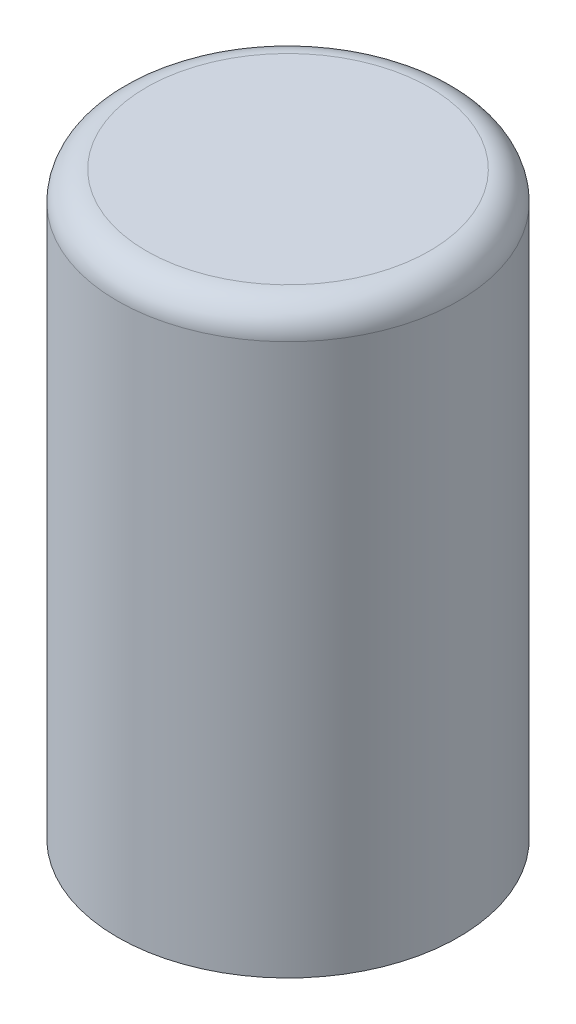
ISO-10303-21;
HEADER;
FILE_DESCRIPTION(('STEP AP214'),'2;1');
FILE_NAME('part.step','',(''),(''),'','','');
FILE_SCHEMA(('AUTOMOTIVE_DESIGN { 1 0 10303 214 1 1 1 1 }'));
ENDSEC;
DATA;
#1=APPLICATION_CONTEXT('core data for automotive mechanical design processes');
#2=APPLICATION_PROTOCOL_DEFINITION('international standard','automotive_design',2000,#1);
#3=PRODUCT_CONTEXT('',#1,'mechanical');
#4=PRODUCT('Part','Part','',(#3));
#5=PRODUCT_RELATED_PRODUCT_CATEGORY('part','',(#4));
#6=PRODUCT_DEFINITION_FORMATION('','',#4);
#7=PRODUCT_DEFINITION_CONTEXT('part definition',#1,'design');
#8=PRODUCT_DEFINITION('design','',#6,#7);
#9=PRODUCT_DEFINITION_SHAPE('','',#8);
#10=(LENGTH_UNIT() NAMED_UNIT(*) SI_UNIT(.MILLI.,.METRE.));
#11=(NAMED_UNIT(*) PLANE_ANGLE_UNIT() SI_UNIT($,.RADIAN.));
#12=(NAMED_UNIT(*) SI_UNIT($,.STERADIAN.) SOLID_ANGLE_UNIT());
#13=UNCERTAINTY_MEASURE_WITH_UNIT(LENGTH_MEASURE(1.E-05),#10,'distance_accuracy_value','');
#14=(GEOMETRIC_REPRESENTATION_CONTEXT(3) GLOBAL_UNCERTAINTY_ASSIGNED_CONTEXT((#13)) GLOBAL_UNIT_ASSIGNED_CONTEXT((#10,
#11,#12)) REPRESENTATION_CONTEXT('',''));
#15=CARTESIAN_POINT('',(0.,0.,0.));
#16=DIRECTION('',(0.,0.,1.));
#17=DIRECTION('',(1.,0.,0.));
#18=AXIS2_PLACEMENT_3D('',#15,#16,#17);
#19=CARTESIAN_POINT('',(0.,51.,0.));
#20=DIRECTION('',(0.,-1.,0.));
#21=DIRECTION('',(0.,0.,-1.));
#22=AXIS2_PLACEMENT_3D('',#19,#20,#21);
#23=CYLINDRICAL_SURFACE('',#22,15.);
#24=CARTESIAN_POINT('',(0.,48.46,0.));
#25=DIRECTION('',(0.,1.,0.));
#26=DIRECTION('',(0.,0.,1.));
#27=AXIS2_PLACEMENT_3D('',#24,#25,#26);
#28=CIRCLE('',#27,15.);
#29=CARTESIAN_POINT('',(0.,48.46,15.));
#30=VERTEX_POINT('',#29);
#31=EDGE_CURVE('E10',#30,#30,#28,.F.);
#32=ORIENTED_EDGE('',*,*,#31,.T.);
#33=EDGE_LOOP('',(#32));
#34=FACE_BOUND('',#33,.T.);
#35=CARTESIAN_POINT('',(0.,0.,0.));
#36=DIRECTION('',(0.,1.,0.));
#37=DIRECTION('',(0.,0.,1.));
#38=AXIS2_PLACEMENT_3D('',#35,#36,#37);
#39=CIRCLE('',#38,15.);
#40=CARTESIAN_POINT('',(0.,0.,15.));
#41=VERTEX_POINT('',#40);
#42=EDGE_CURVE('E44',#41,#41,#39,.T.);
#43=ORIENTED_EDGE('',*,*,#42,.T.);
#44=EDGE_LOOP('',(#43));
#45=FACE_BOUND('',#44,.T.);
#46=ADVANCED_FACE('F33',(#34,#45),#23,.T.);
#47=CARTESIAN_POINT('',(0.,51.,0.));
#48=DIRECTION('',(0.,1.,0.));
#49=DIRECTION('',(0.,0.,1.));
#50=AXIS2_PLACEMENT_3D('',#47,#48,#49);
#51=PLANE('',#50);
#52=CARTESIAN_POINT('',(0.,51.,0.));
#53=DIRECTION('',(0.,1.,0.));
#54=DIRECTION('',(0.,0.,1.));
#55=AXIS2_PLACEMENT_3D('',#52,#53,#54);
#56=CIRCLE('',#55,12.46);
#57=CARTESIAN_POINT('',(0.,51.,12.46));
#58=VERTEX_POINT('',#57);
#59=EDGE_CURVE('E40',#58,#58,#56,.T.);
#60=ORIENTED_EDGE('',*,*,#59,.T.);
#61=EDGE_LOOP('',(#60));
#62=FACE_BOUND('',#61,.T.);
#63=ADVANCED_FACE('F68',(#62),#51,.T.);
#64=CARTESIAN_POINT('',(0.,0.,0.));
#65=DIRECTION('',(0.,1.,0.));
#66=DIRECTION('',(0.,0.,1.));
#67=AXIS2_PLACEMENT_3D('',#64,#65,#66);
#68=PLANE('',#67);
#69=CARTESIAN_POINT('',(0.,0.,0.));
#70=DIRECTION('',(0.,-1.,0.));
#71=DIRECTION('',(0.,0.,-1.));
#72=AXIS2_PLACEMENT_3D('',#69,#70,#71);
#73=CIRCLE('',#72,3.095);
#74=CARTESIAN_POINT('',(0.,0.,-3.095));
#75=VERTEX_POINT('',#74);
#76=EDGE_CURVE('E51',#75,#75,#73,.T.);
#77=ORIENTED_EDGE('',*,*,#76,.F.);
#78=EDGE_LOOP('',(#77));
#79=FACE_BOUND('',#78,.T.);
#80=ORIENTED_EDGE('',*,*,#42,.F.);
#81=EDGE_LOOP('',(#80));
#82=FACE_BOUND('',#81,.T.);
#83=ADVANCED_FACE('F65',(#79,#82),#68,.F.);
#84=CARTESIAN_POINT('',(0.,48.46,0.));
#85=DIRECTION('',(0.,1.,0.));
#86=DIRECTION('',(0.,0.,1.));
#87=AXIS2_PLACEMENT_3D('',#84,#85,#86);
#88=TOROIDAL_SURFACE('',#87,12.46,2.54);
#89=ORIENTED_EDGE('',*,*,#31,.F.);
#90=EDGE_LOOP('',(#89));
#91=FACE_BOUND('',#90,.T.);
#92=ORIENTED_EDGE('',*,*,#59,.F.);
#93=EDGE_LOOP('',(#92));
#94=FACE_BOUND('',#93,.T.);
#95=ADVANCED_FACE('F35',(#91,#94),#88,.T.);
#96=CARTESIAN_POINT('',(0.,12.7,0.));
#97=DIRECTION('',(0.,-1.,0.));
#98=DIRECTION('',(0.,0.,-1.));
#99=AXIS2_PLACEMENT_3D('',#96,#97,#98);
#100=CYLINDRICAL_SURFACE('',#99,3.095);
#101=CARTESIAN_POINT('',(0.,12.7,0.));
#102=DIRECTION('',(0.,-1.,0.));
#103=DIRECTION('',(0.,0.,-1.));
#104=AXIS2_PLACEMENT_3D('',#101,#102,#103);
#105=CIRCLE('',#104,3.095);
#106=CARTESIAN_POINT('',(0.,12.7,-3.095));
#107=VERTEX_POINT('',#106);
#108=EDGE_CURVE('E48',#107,#107,#105,.T.);
#109=ORIENTED_EDGE('',*,*,#108,.F.);
#110=EDGE_LOOP('',(#109));
#111=FACE_BOUND('',#110,.T.);
#112=ORIENTED_EDGE('',*,*,#76,.T.);
#113=EDGE_LOOP('',(#112));
#114=FACE_BOUND('',#113,.T.);
#115=ADVANCED_FACE('F59',(#111,#114),#100,.F.);
#116=CARTESIAN_POINT('',(0.,12.7,0.));
#117=DIRECTION('',(0.,-1.,0.));
#118=DIRECTION('',(0.,0.,-1.));
#119=AXIS2_PLACEMENT_3D('',#116,#117,#118);
#120=PLANE('',#119);
#121=ORIENTED_EDGE('',*,*,#108,.T.);
#122=EDGE_LOOP('',(#121));
#123=FACE_BOUND('',#122,.T.);
#124=ADVANCED_FACE('F57',(#123),#120,.T.);
#125=CLOSED_SHELL('',(#46,#63,#83,#95,#115,#124));
#126=MANIFOLD_SOLID_BREP('B2',#125);
#127=ADVANCED_BREP_SHAPE_REPRESENTATION('',(#18,#126),#14);
#128=SHAPE_DEFINITION_REPRESENTATION(#9,#127);
ENDSEC;
END-ISO-10303-21;
